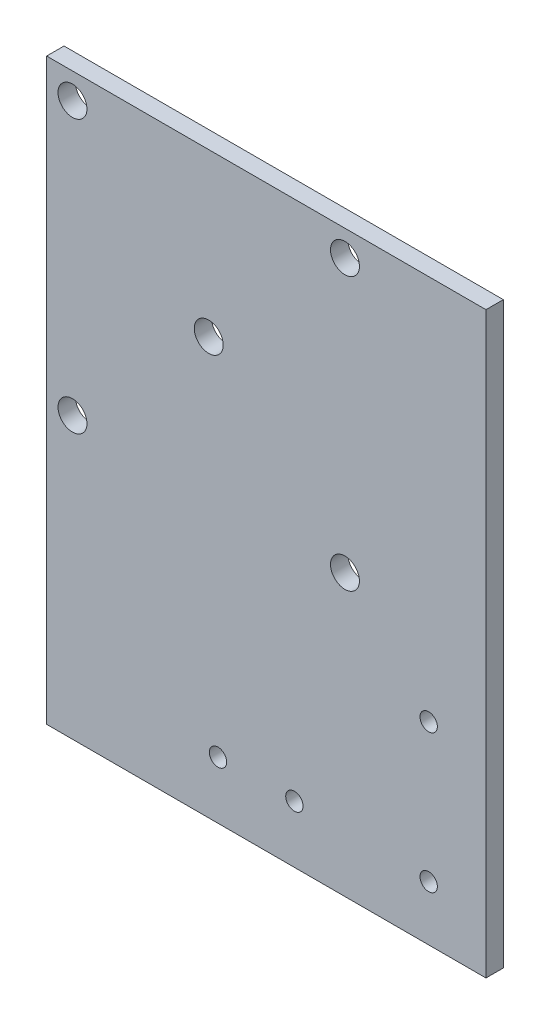
ISO-10303-21;
HEADER;
FILE_DESCRIPTION(('STEP AP214'),'2;1');
FILE_NAME('part.step','',(''),(''),'','','');
FILE_SCHEMA(('AUTOMOTIVE_DESIGN { 1 0 10303 214 1 1 1 1 }'));
ENDSEC;
DATA;
#1=APPLICATION_CONTEXT('core data for automotive mechanical design processes');
#2=APPLICATION_PROTOCOL_DEFINITION('international standard','automotive_design',2000,#1);
#3=PRODUCT_CONTEXT('',#1,'mechanical');
#4=PRODUCT('Part','Part','',(#3));
#5=PRODUCT_RELATED_PRODUCT_CATEGORY('part','',(#4));
#6=PRODUCT_DEFINITION_FORMATION('','',#4);
#7=PRODUCT_DEFINITION_CONTEXT('part definition',#1,'design');
#8=PRODUCT_DEFINITION('design','',#6,#7);
#9=PRODUCT_DEFINITION_SHAPE('','',#8);
#10=(LENGTH_UNIT() NAMED_UNIT(*) SI_UNIT(.MILLI.,.METRE.));
#11=(NAMED_UNIT(*) PLANE_ANGLE_UNIT() SI_UNIT($,.RADIAN.));
#12=(NAMED_UNIT(*) SI_UNIT($,.STERADIAN.) SOLID_ANGLE_UNIT());
#13=UNCERTAINTY_MEASURE_WITH_UNIT(LENGTH_MEASURE(1.E-05),#10,'distance_accuracy_value','');
#14=(GEOMETRIC_REPRESENTATION_CONTEXT(3) GLOBAL_UNCERTAINTY_ASSIGNED_CONTEXT((#13)) GLOBAL_UNIT_ASSIGNED_CONTEXT((#10,
#11,#12)) REPRESENTATION_CONTEXT('',''));
#15=CARTESIAN_POINT('',(0.,0.,0.));
#16=DIRECTION('',(0.,0.,1.));
#17=DIRECTION('',(1.,0.,0.));
#18=AXIS2_PLACEMENT_3D('',#15,#16,#17);
#19=CARTESIAN_POINT('',(0.,0.,3.));
#20=DIRECTION('',(1.,0.,0.));
#21=DIRECTION('',(0.,0.,-1.));
#22=AXIS2_PLACEMENT_3D('',#19,#20,#21);
#23=PLANE('',#22);
#24=DIRECTION('',(0.,-1.,0.));
#25=VECTOR('',#24,1.);
#26=CARTESIAN_POINT('',(0.,0.,0.));
#27=LINE('',#26,#25);
#28=CARTESIAN_POINT('',(0.,100.,0.));
#29=VERTEX_POINT('',#28);
#30=CARTESIAN_POINT('',(0.,0.,0.));
#31=VERTEX_POINT('',#30);
#32=EDGE_CURVE('E100',#29,#31,#27,.T.);
#33=ORIENTED_EDGE('',*,*,#32,.T.);
#34=DIRECTION('',(0.,0.,-1.));
#35=VECTOR('',#34,1.);
#36=CARTESIAN_POINT('',(0.,0.,3.));
#37=LINE('',#36,#35);
#38=CARTESIAN_POINT('',(0.,0.,3.));
#39=VERTEX_POINT('',#38);
#40=EDGE_CURVE('E11',#39,#31,#37,.T.);
#41=ORIENTED_EDGE('',*,*,#40,.F.);
#42=DIRECTION('',(0.,-1.,0.));
#43=VECTOR('',#42,1.);
#44=CARTESIAN_POINT('',(0.,0.,3.));
#45=LINE('',#44,#43);
#46=CARTESIAN_POINT('',(0.,100.,3.));
#47=VERTEX_POINT('',#46);
#48=EDGE_CURVE('E87',#47,#39,#45,.T.);
#49=ORIENTED_EDGE('',*,*,#48,.F.);
#50=DIRECTION('',(0.,0.,-1.));
#51=VECTOR('',#50,1.);
#52=CARTESIAN_POINT('',(0.,100.,3.));
#53=LINE('',#52,#51);
#54=EDGE_CURVE('E96',#47,#29,#53,.T.);
#55=ORIENTED_EDGE('',*,*,#54,.T.);
#56=EDGE_LOOP('',(#33,#41,#49,#55));
#57=FACE_BOUND('',#56,.T.);
#58=ADVANCED_FACE('F34',(#57),#23,.F.);
#59=CARTESIAN_POINT('',(0.,0.,3.));
#60=DIRECTION('',(0.,1.,0.));
#61=DIRECTION('',(0.,0.,1.));
#62=AXIS2_PLACEMENT_3D('',#59,#60,#61);
#63=PLANE('',#62);
#64=DIRECTION('',(1.,0.,0.));
#65=VECTOR('',#64,1.);
#66=CARTESIAN_POINT('',(0.,0.,0.));
#67=LINE('',#66,#65);
#68=CARTESIAN_POINT('',(75.9,0.,0.));
#69=VERTEX_POINT('',#68);
#70=EDGE_CURVE('E91',#31,#69,#67,.T.);
#71=ORIENTED_EDGE('',*,*,#70,.T.);
#72=DIRECTION('',(0.,0.,-1.));
#73=VECTOR('',#72,1.);
#74=CARTESIAN_POINT('',(75.9,0.,3.));
#75=LINE('',#74,#73);
#76=CARTESIAN_POINT('',(75.9,0.,3.));
#77=VERTEX_POINT('',#76);
#78=EDGE_CURVE('E43',#77,#69,#75,.T.);
#79=ORIENTED_EDGE('',*,*,#78,.F.);
#80=DIRECTION('',(1.,0.,0.));
#81=VECTOR('',#80,1.);
#82=CARTESIAN_POINT('',(0.,0.,3.));
#83=LINE('',#82,#81);
#84=EDGE_CURVE('E82',#39,#77,#83,.T.);
#85=ORIENTED_EDGE('',*,*,#84,.F.);
#86=ORIENTED_EDGE('',*,*,#40,.T.);
#87=EDGE_LOOP('',(#71,#79,#85,#86));
#88=FACE_BOUND('',#87,.T.);
#89=ADVANCED_FACE('F90',(#88),#63,.F.);
#90=CARTESIAN_POINT('',(75.9,0.,3.));
#91=DIRECTION('',(-1.,0.,0.));
#92=DIRECTION('',(0.,0.,1.));
#93=AXIS2_PLACEMENT_3D('',#90,#91,#92);
#94=PLANE('',#93);
#95=DIRECTION('',(0.,1.,0.));
#96=VECTOR('',#95,1.);
#97=CARTESIAN_POINT('',(75.9,0.,0.));
#98=LINE('',#97,#96);
#99=CARTESIAN_POINT('',(75.9,100.,0.));
#100=VERTEX_POINT('',#99);
#101=EDGE_CURVE('E69',#69,#100,#98,.T.);
#102=ORIENTED_EDGE('',*,*,#101,.T.);
#103=DIRECTION('',(0.,0.,-1.));
#104=VECTOR('',#103,1.);
#105=CARTESIAN_POINT('',(75.9,100.,3.));
#106=LINE('',#105,#104);
#107=CARTESIAN_POINT('',(75.9,100.,3.));
#108=VERTEX_POINT('',#107);
#109=EDGE_CURVE('E92',#108,#100,#106,.T.);
#110=ORIENTED_EDGE('',*,*,#109,.F.);
#111=DIRECTION('',(0.,1.,0.));
#112=VECTOR('',#111,1.);
#113=CARTESIAN_POINT('',(75.9,0.,3.));
#114=LINE('',#113,#112);
#115=EDGE_CURVE('E85',#77,#108,#114,.T.);
#116=ORIENTED_EDGE('',*,*,#115,.F.);
#117=ORIENTED_EDGE('',*,*,#78,.T.);
#118=EDGE_LOOP('',(#102,#110,#116,#117));
#119=FACE_BOUND('',#118,.T.);
#120=ADVANCED_FACE('F94',(#119),#94,.F.);
#121=CARTESIAN_POINT('',(0.,100.,3.));
#122=DIRECTION('',(0.,-1.,0.));
#123=DIRECTION('',(0.,0.,-1.));
#124=AXIS2_PLACEMENT_3D('',#121,#122,#123);
#125=PLANE('',#124);
#126=DIRECTION('',(-1.,0.,0.));
#127=VECTOR('',#126,1.);
#128=CARTESIAN_POINT('',(0.,100.,0.));
#129=LINE('',#128,#127);
#130=EDGE_CURVE('E75',#100,#29,#129,.T.);
#131=ORIENTED_EDGE('',*,*,#130,.T.);
#132=ORIENTED_EDGE('',*,*,#54,.F.);
#133=DIRECTION('',(-1.,0.,0.));
#134=VECTOR('',#133,1.);
#135=CARTESIAN_POINT('',(0.,100.,3.));
#136=LINE('',#135,#134);
#137=EDGE_CURVE('E52',#108,#47,#136,.T.);
#138=ORIENTED_EDGE('',*,*,#137,.F.);
#139=ORIENTED_EDGE('',*,*,#109,.T.);
#140=EDGE_LOOP('',(#131,#132,#138,#139));
#141=FACE_BOUND('',#140,.T.);
#142=ADVANCED_FACE('F170',(#141),#125,.F.);
#143=CARTESIAN_POINT('',(0.,0.,3.));
#144=DIRECTION('',(0.,0.,-1.));
#145=DIRECTION('',(-1.,0.,0.));
#146=AXIS2_PLACEMENT_3D('',#143,#144,#145);
#147=PLANE('',#146);
#148=CARTESIAN_POINT('',(27.9999999999996,72.,3.));
#149=DIRECTION('',(0.,0.,-1.));
#150=DIRECTION('',(-1.,0.,0.));
#151=AXIS2_PLACEMENT_3D('',#148,#149,#150);
#152=CIRCLE('',#151,2.5);
#153=CARTESIAN_POINT('',(25.4999999999996,72.,3.));
#154=VERTEX_POINT('',#153);
#155=EDGE_CURVE('E293',#154,#154,#152,.T.);
#156=ORIENTED_EDGE('',*,*,#155,.T.);
#157=EDGE_LOOP('',(#156));
#158=FACE_BOUND('',#157,.T.);
#159=CARTESIAN_POINT('',(42.8000000000001,9.90000000000004,3.));
#160=DIRECTION('',(0.,0.,-1.));
#161=DIRECTION('',(-1.,0.,0.));
#162=AXIS2_PLACEMENT_3D('',#159,#160,#161);
#163=CIRCLE('',#162,1.5);
#164=CARTESIAN_POINT('',(41.3000000000001,9.90000000000004,3.));
#165=VERTEX_POINT('',#164);
#166=EDGE_CURVE('E297',#165,#165,#163,.T.);
#167=ORIENTED_EDGE('',*,*,#166,.T.);
#168=EDGE_LOOP('',(#167));
#169=FACE_BOUND('',#168,.T.);
#170=CARTESIAN_POINT('',(29.6000000000001,9.90000000000004,3.));
#171=DIRECTION('',(0.,0.,-1.));
#172=DIRECTION('',(-1.,0.,0.));
#173=AXIS2_PLACEMENT_3D('',#170,#171,#172);
#174=CIRCLE('',#173,1.5);
#175=CARTESIAN_POINT('',(28.1000000000001,9.90000000000004,3.));
#176=VERTEX_POINT('',#175);
#177=EDGE_CURVE('E305',#176,#176,#174,.T.);
#178=ORIENTED_EDGE('',*,*,#177,.T.);
#179=EDGE_LOOP('',(#178));
#180=FACE_BOUND('',#179,.T.);
#181=CARTESIAN_POINT('',(66.0000000000001,9.47099371364919,3.));
#182=DIRECTION('',(0.,0.,1.));
#183=DIRECTION('',(1.,0.,0.));
#184=AXIS2_PLACEMENT_3D('',#181,#182,#183);
#185=CIRCLE('',#184,1.5);
#186=CARTESIAN_POINT('',(67.5000000000001,9.47099371364919,3.));
#187=VERTEX_POINT('',#186);
#188=EDGE_CURVE('E122',#187,#187,#185,.T.);
#189=ORIENTED_EDGE('',*,*,#188,.F.);
#190=EDGE_LOOP('',(#189));
#191=FACE_BOUND('',#190,.T.);
#192=CARTESIAN_POINT('',(66.0000000000001,33.3913700508154,3.));
#193=DIRECTION('',(0.,0.,1.));
#194=DIRECTION('',(1.,0.,0.));
#195=AXIS2_PLACEMENT_3D('',#192,#193,#194);
#196=CIRCLE('',#195,1.5);
#197=CARTESIAN_POINT('',(67.5000000000001,33.3913700508154,3.));
#198=VERTEX_POINT('',#197);
#199=EDGE_CURVE('E111',#198,#198,#196,.T.);
#200=ORIENTED_EDGE('',*,*,#199,.F.);
#201=EDGE_LOOP('',(#200));
#202=FACE_BOUND('',#201,.T.);
#203=CARTESIAN_POINT('',(51.5385822331381,48.4614177668615,3.));
#204=DIRECTION('',(0.,0.,-1.));
#205=DIRECTION('',(-1.,0.,0.));
#206=AXIS2_PLACEMENT_3D('',#203,#204,#205);
#207=CIRCLE('',#206,2.50000000000097);
#208=CARTESIAN_POINT('',(49.0385822331371,48.4614177668615,3.));
#209=VERTEX_POINT('',#208);
#210=EDGE_CURVE('E115',#209,#209,#207,.T.);
#211=ORIENTED_EDGE('',*,*,#210,.T.);
#212=EDGE_LOOP('',(#211));
#213=FACE_BOUND('',#212,.T.);
#214=CARTESIAN_POINT('',(4.46141776686215,48.4614177668615,3.));
#215=DIRECTION('',(0.,0.,-1.));
#216=DIRECTION('',(-1.,0.,0.));
#217=AXIS2_PLACEMENT_3D('',#214,#215,#216);
#218=CIRCLE('',#217,2.50000000000097);
#219=CARTESIAN_POINT('',(1.96141776686118,48.4614177668615,3.));
#220=VERTEX_POINT('',#219);
#221=EDGE_CURVE('E131',#220,#220,#218,.T.);
#222=ORIENTED_EDGE('',*,*,#221,.T.);
#223=EDGE_LOOP('',(#222));
#224=FACE_BOUND('',#223,.T.);
#225=CARTESIAN_POINT('',(4.46141776686213,95.5385822331373,3.));
#226=DIRECTION('',(0.,0.,-1.));
#227=DIRECTION('',(-1.,0.,0.));
#228=AXIS2_PLACEMENT_3D('',#225,#226,#227);
#229=CIRCLE('',#228,2.50000000000097);
#230=CARTESIAN_POINT('',(1.96141776686117,95.5385822331373,3.));
#231=VERTEX_POINT('',#230);
#232=EDGE_CURVE('E137',#231,#231,#229,.T.);
#233=ORIENTED_EDGE('',*,*,#232,.T.);
#234=EDGE_LOOP('',(#233));
#235=FACE_BOUND('',#234,.T.);
#236=CARTESIAN_POINT('',(51.5385822331375,95.5385822331374,3.));
#237=DIRECTION('',(0.,0.,-1.));
#238=DIRECTION('',(-1.,0.,0.));
#239=AXIS2_PLACEMENT_3D('',#236,#237,#238);
#240=CIRCLE('',#239,2.50000000000097);
#241=CARTESIAN_POINT('',(49.0385822331365,95.5385822331374,3.));
#242=VERTEX_POINT('',#241);
#243=EDGE_CURVE('E103',#242,#242,#240,.T.);
#244=ORIENTED_EDGE('',*,*,#243,.T.);
#245=EDGE_LOOP('',(#244));
#246=FACE_BOUND('',#245,.T.);
#247=ORIENTED_EDGE('',*,*,#48,.T.);
#248=ORIENTED_EDGE('',*,*,#84,.T.);
#249=ORIENTED_EDGE('',*,*,#115,.T.);
#250=ORIENTED_EDGE('',*,*,#137,.T.);
#251=EDGE_LOOP('',(#247,#248,#249,#250));
#252=FACE_BOUND('',#251,.T.);
#253=ADVANCED_FACE('F83',(#158,#169,#180,#191,#202,#213,#224,#235,#246,#252),#147,.F.);
#254=CARTESIAN_POINT('',(0.,0.,0.));
#255=DIRECTION('',(0.,0.,-1.));
#256=DIRECTION('',(-1.,0.,0.));
#257=AXIS2_PLACEMENT_3D('',#254,#255,#256);
#258=PLANE('',#257);
#259=CARTESIAN_POINT('',(27.9999999999996,72.,0.));
#260=DIRECTION('',(0.,0.,-1.));
#261=DIRECTION('',(-1.,0.,0.));
#262=AXIS2_PLACEMENT_3D('',#259,#260,#261);
#263=CIRCLE('',#262,2.5);
#264=CARTESIAN_POINT('',(25.4999999999996,72.,0.));
#265=VERTEX_POINT('',#264);
#266=EDGE_CURVE('E290',#265,#265,#263,.T.);
#267=ORIENTED_EDGE('',*,*,#266,.F.);
#268=EDGE_LOOP('',(#267));
#269=FACE_BOUND('',#268,.T.);
#270=CARTESIAN_POINT('',(42.8000000000001,9.90000000000004,0.));
#271=DIRECTION('',(0.,0.,-1.));
#272=DIRECTION('',(-1.,0.,0.));
#273=AXIS2_PLACEMENT_3D('',#270,#271,#272);
#274=CIRCLE('',#273,1.5);
#275=CARTESIAN_POINT('',(41.3000000000001,9.90000000000004,0.));
#276=VERTEX_POINT('',#275);
#277=EDGE_CURVE('E294',#276,#276,#274,.T.);
#278=ORIENTED_EDGE('',*,*,#277,.F.);
#279=EDGE_LOOP('',(#278));
#280=FACE_BOUND('',#279,.T.);
#281=CARTESIAN_POINT('',(29.6000000000001,9.90000000000004,0.));
#282=DIRECTION('',(0.,0.,-1.));
#283=DIRECTION('',(-1.,0.,0.));
#284=AXIS2_PLACEMENT_3D('',#281,#282,#283);
#285=CIRCLE('',#284,1.5);
#286=CARTESIAN_POINT('',(28.1000000000001,9.90000000000004,0.));
#287=VERTEX_POINT('',#286);
#288=EDGE_CURVE('E303',#287,#287,#285,.T.);
#289=ORIENTED_EDGE('',*,*,#288,.F.);
#290=EDGE_LOOP('',(#289));
#291=FACE_BOUND('',#290,.T.);
#292=CARTESIAN_POINT('',(66.0000000000001,9.47099371364919,0.));
#293=DIRECTION('',(0.,0.,-1.));
#294=DIRECTION('',(-1.,0.,0.));
#295=AXIS2_PLACEMENT_3D('',#292,#293,#294);
#296=CIRCLE('',#295,1.5);
#297=CARTESIAN_POINT('',(64.5000000000001,9.47099371364919,0.));
#298=VERTEX_POINT('',#297);
#299=EDGE_CURVE('E37',#298,#298,#296,.T.);
#300=ORIENTED_EDGE('',*,*,#299,.F.);
#301=EDGE_LOOP('',(#300));
#302=FACE_BOUND('',#301,.T.);
#303=CARTESIAN_POINT('',(66.0000000000001,33.3913700508154,0.));
#304=DIRECTION('',(0.,0.,-1.));
#305=DIRECTION('',(-1.,0.,0.));
#306=AXIS2_PLACEMENT_3D('',#303,#304,#305);
#307=CIRCLE('',#306,1.5);
#308=CARTESIAN_POINT('',(64.5000000000001,33.3913700508154,0.));
#309=VERTEX_POINT('',#308);
#310=EDGE_CURVE('E108',#309,#309,#307,.T.);
#311=ORIENTED_EDGE('',*,*,#310,.F.);
#312=EDGE_LOOP('',(#311));
#313=FACE_BOUND('',#312,.T.);
#314=CARTESIAN_POINT('',(51.5385822331381,48.4614177668615,0.));
#315=DIRECTION('',(0.,0.,-1.));
#316=DIRECTION('',(-1.,0.,0.));
#317=AXIS2_PLACEMENT_3D('',#314,#315,#316);
#318=CIRCLE('',#317,2.50000000000097);
#319=CARTESIAN_POINT('',(49.0385822331371,48.4614177668615,0.));
#320=VERTEX_POINT('',#319);
#321=EDGE_CURVE('E110',#320,#320,#318,.T.);
#322=ORIENTED_EDGE('',*,*,#321,.F.);
#323=EDGE_LOOP('',(#322));
#324=FACE_BOUND('',#323,.T.);
#325=CARTESIAN_POINT('',(4.46141776686215,48.4614177668615,0.));
#326=DIRECTION('',(0.,0.,-1.));
#327=DIRECTION('',(-1.,0.,0.));
#328=AXIS2_PLACEMENT_3D('',#325,#326,#327);
#329=CIRCLE('',#328,2.50000000000097);
#330=CARTESIAN_POINT('',(1.96141776686118,48.4614177668615,0.));
#331=VERTEX_POINT('',#330);
#332=EDGE_CURVE('E128',#331,#331,#329,.T.);
#333=ORIENTED_EDGE('',*,*,#332,.F.);
#334=EDGE_LOOP('',(#333));
#335=FACE_BOUND('',#334,.T.);
#336=CARTESIAN_POINT('',(4.46141776686213,95.5385822331373,0.));
#337=DIRECTION('',(0.,0.,-1.));
#338=DIRECTION('',(-1.,0.,0.));
#339=AXIS2_PLACEMENT_3D('',#336,#337,#338);
#340=CIRCLE('',#339,2.50000000000097);
#341=CARTESIAN_POINT('',(1.96141776686117,95.5385822331373,0.));
#342=VERTEX_POINT('',#341);
#343=EDGE_CURVE('E134',#342,#342,#340,.T.);
#344=ORIENTED_EDGE('',*,*,#343,.F.);
#345=EDGE_LOOP('',(#344));
#346=FACE_BOUND('',#345,.T.);
#347=CARTESIAN_POINT('',(51.5385822331375,95.5385822331374,0.));
#348=DIRECTION('',(0.,0.,-1.));
#349=DIRECTION('',(-1.,0.,0.));
#350=AXIS2_PLACEMENT_3D('',#347,#348,#349);
#351=CIRCLE('',#350,2.50000000000097);
#352=CARTESIAN_POINT('',(49.0385822331365,95.5385822331374,0.));
#353=VERTEX_POINT('',#352);
#354=EDGE_CURVE('E140',#353,#353,#351,.T.);
#355=ORIENTED_EDGE('',*,*,#354,.F.);
#356=EDGE_LOOP('',(#355));
#357=FACE_BOUND('',#356,.T.);
#358=ORIENTED_EDGE('',*,*,#32,.F.);
#359=ORIENTED_EDGE('',*,*,#130,.F.);
#360=ORIENTED_EDGE('',*,*,#101,.F.);
#361=ORIENTED_EDGE('',*,*,#70,.F.);
#362=EDGE_LOOP('',(#358,#359,#360,#361));
#363=FACE_BOUND('',#362,.T.);
#364=ADVANCED_FACE('F150',(#269,#280,#291,#302,#313,#324,#335,#346,#357,#363),#258,.T.);
#365=CARTESIAN_POINT('',(51.5385822331375,95.5385822331374,10.));
#366=DIRECTION('',(0.,0.,-1.));
#367=DIRECTION('',(-1.,0.,0.));
#368=AXIS2_PLACEMENT_3D('',#365,#366,#367);
#369=CYLINDRICAL_SURFACE('',#368,2.50000000000097);
#370=ORIENTED_EDGE('',*,*,#354,.T.);
#371=EDGE_LOOP('',(#370));
#372=FACE_BOUND('',#371,.T.);
#373=ORIENTED_EDGE('',*,*,#243,.F.);
#374=EDGE_LOOP('',(#373));
#375=FACE_BOUND('',#374,.T.);
#376=ADVANCED_FACE('F147',(#372,#375),#369,.F.);
#377=CARTESIAN_POINT('',(4.46141776686213,95.5385822331373,10.));
#378=DIRECTION('',(0.,0.,-1.));
#379=DIRECTION('',(-1.,0.,0.));
#380=AXIS2_PLACEMENT_3D('',#377,#378,#379);
#381=CYLINDRICAL_SURFACE('',#380,2.50000000000097);
#382=ORIENTED_EDGE('',*,*,#343,.T.);
#383=EDGE_LOOP('',(#382));
#384=FACE_BOUND('',#383,.T.);
#385=ORIENTED_EDGE('',*,*,#232,.F.);
#386=EDGE_LOOP('',(#385));
#387=FACE_BOUND('',#386,.T.);
#388=ADVANCED_FACE('F149',(#384,#387),#381,.F.);
#389=CARTESIAN_POINT('',(4.46141776686215,48.4614177668615,10.));
#390=DIRECTION('',(0.,0.,-1.));
#391=DIRECTION('',(-1.,0.,0.));
#392=AXIS2_PLACEMENT_3D('',#389,#390,#391);
#393=CYLINDRICAL_SURFACE('',#392,2.50000000000097);
#394=ORIENTED_EDGE('',*,*,#332,.T.);
#395=EDGE_LOOP('',(#394));
#396=FACE_BOUND('',#395,.T.);
#397=ORIENTED_EDGE('',*,*,#221,.F.);
#398=EDGE_LOOP('',(#397));
#399=FACE_BOUND('',#398,.T.);
#400=ADVANCED_FACE('F157',(#396,#399),#393,.F.);
#401=CARTESIAN_POINT('',(51.5385822331381,48.4614177668615,10.));
#402=DIRECTION('',(0.,0.,-1.));
#403=DIRECTION('',(-1.,0.,0.));
#404=AXIS2_PLACEMENT_3D('',#401,#402,#403);
#405=CYLINDRICAL_SURFACE('',#404,2.50000000000097);
#406=ORIENTED_EDGE('',*,*,#321,.T.);
#407=EDGE_LOOP('',(#406));
#408=FACE_BOUND('',#407,.T.);
#409=ORIENTED_EDGE('',*,*,#210,.F.);
#410=EDGE_LOOP('',(#409));
#411=FACE_BOUND('',#410,.T.);
#412=ADVANCED_FACE('F226',(#408,#411),#405,.F.);
#413=CARTESIAN_POINT('',(66.0000000000001,33.3913700508154,-7.));
#414=DIRECTION('',(0.,0.,1.));
#415=DIRECTION('',(1.,0.,0.));
#416=AXIS2_PLACEMENT_3D('',#413,#414,#415);
#417=CYLINDRICAL_SURFACE('',#416,1.5);
#418=ORIENTED_EDGE('',*,*,#310,.T.);
#419=EDGE_LOOP('',(#418));
#420=FACE_BOUND('',#419,.T.);
#421=ORIENTED_EDGE('',*,*,#199,.T.);
#422=EDGE_LOOP('',(#421));
#423=FACE_BOUND('',#422,.T.);
#424=ADVANCED_FACE('F235',(#420,#423),#417,.F.);
#425=CARTESIAN_POINT('',(66.0000000000001,9.47099371364919,-7.));
#426=DIRECTION('',(0.,0.,1.));
#427=DIRECTION('',(1.,0.,0.));
#428=AXIS2_PLACEMENT_3D('',#425,#426,#427);
#429=CYLINDRICAL_SURFACE('',#428,1.5);
#430=ORIENTED_EDGE('',*,*,#299,.T.);
#431=EDGE_LOOP('',(#430));
#432=FACE_BOUND('',#431,.T.);
#433=ORIENTED_EDGE('',*,*,#188,.T.);
#434=EDGE_LOOP('',(#433));
#435=FACE_BOUND('',#434,.T.);
#436=ADVANCED_FACE('F244',(#432,#435),#429,.F.);
#437=CARTESIAN_POINT('',(29.6000000000001,9.90000000000004,19.8));
#438=DIRECTION('',(0.,0.,-1.));
#439=DIRECTION('',(-1.,0.,0.));
#440=AXIS2_PLACEMENT_3D('',#437,#438,#439);
#441=CYLINDRICAL_SURFACE('',#440,1.5);
#442=CARTESIAN_POINT('',(28.1000000000001,9.90000000000004,0.));
#443=CARTESIAN_POINT('',(28.1000000000001,9.90000000000004,0.03125));
#444=CARTESIAN_POINT('',(28.1000000000001,9.90000000000004,0.0625000000000001));
#445=CARTESIAN_POINT('',(28.1000000000001,9.90000000000004,0.125));
#446=CARTESIAN_POINT('',(28.1000000000001,9.90000000000004,0.15625));
#447=CARTESIAN_POINT('',(28.1000000000001,9.90000000000004,0.21875));
#448=CARTESIAN_POINT('',(28.1000000000001,9.90000000000004,0.25));
#449=CARTESIAN_POINT('',(28.1000000000001,9.90000000000004,0.3125));
#450=CARTESIAN_POINT('',(28.1000000000001,9.90000000000004,0.34375));
#451=CARTESIAN_POINT('',(28.1000000000001,9.90000000000004,0.40625));
#452=CARTESIAN_POINT('',(28.1000000000001,9.90000000000004,0.4375));
#453=CARTESIAN_POINT('',(28.1000000000001,9.90000000000004,0.5));
#454=CARTESIAN_POINT('',(28.1000000000001,9.90000000000004,0.53125));
#455=CARTESIAN_POINT('',(28.1000000000001,9.90000000000004,0.593750000000001));
#456=CARTESIAN_POINT('',(28.1000000000001,9.90000000000004,0.625000000000001));
#457=CARTESIAN_POINT('',(28.1000000000001,9.90000000000004,0.687500000000001));
#458=CARTESIAN_POINT('',(28.1000000000001,9.90000000000004,0.718750000000001));
#459=CARTESIAN_POINT('',(28.1000000000001,9.90000000000004,0.781250000000001));
#460=CARTESIAN_POINT('',(28.1000000000001,9.90000000000004,0.812500000000001));
#461=CARTESIAN_POINT('',(28.1000000000001,9.90000000000004,0.875000000000001));
#462=CARTESIAN_POINT('',(28.1000000000001,9.90000000000004,0.906250000000001));
#463=CARTESIAN_POINT('',(28.1000000000001,9.90000000000004,0.968750000000001));
#464=CARTESIAN_POINT('',(28.1000000000001,9.90000000000004,1.));
#465=CARTESIAN_POINT('',(28.1000000000001,9.90000000000004,1.0625));
#466=CARTESIAN_POINT('',(28.1000000000001,9.90000000000004,1.09375));
#467=CARTESIAN_POINT('',(28.1000000000001,9.90000000000004,1.15625));
#468=CARTESIAN_POINT('',(28.1000000000001,9.90000000000004,1.1875));
#469=CARTESIAN_POINT('',(28.1000000000001,9.90000000000004,1.25));
#470=CARTESIAN_POINT('',(28.1000000000001,9.90000000000004,1.28125));
#471=CARTESIAN_POINT('',(28.1000000000001,9.90000000000004,1.34375));
#472=CARTESIAN_POINT('',(28.1000000000001,9.90000000000004,1.375));
#473=CARTESIAN_POINT('',(28.1000000000001,9.90000000000004,1.4375));
#474=CARTESIAN_POINT('',(28.1000000000001,9.90000000000004,1.46875));
#475=CARTESIAN_POINT('',(28.1000000000001,9.90000000000004,1.53125));
#476=CARTESIAN_POINT('',(28.1000000000001,9.90000000000004,1.5625));
#477=CARTESIAN_POINT('',(28.1000000000001,9.90000000000004,1.625));
#478=CARTESIAN_POINT('',(28.1000000000001,9.90000000000004,1.65625));
#479=CARTESIAN_POINT('',(28.1000000000001,9.90000000000004,1.71875));
#480=CARTESIAN_POINT('',(28.1000000000001,9.90000000000004,1.75));
#481=CARTESIAN_POINT('',(28.1000000000001,9.90000000000004,1.8125));
#482=CARTESIAN_POINT('',(28.1000000000001,9.90000000000004,1.84375));
#483=CARTESIAN_POINT('',(28.1000000000001,9.90000000000004,1.90625));
#484=CARTESIAN_POINT('',(28.1000000000001,9.90000000000004,1.9375));
#485=CARTESIAN_POINT('',(28.1000000000001,9.90000000000004,2.));
#486=CARTESIAN_POINT('',(28.1000000000001,9.90000000000004,2.03125));
#487=CARTESIAN_POINT('',(28.1000000000001,9.90000000000004,2.09375));
#488=CARTESIAN_POINT('',(28.1000000000001,9.90000000000004,2.125));
#489=CARTESIAN_POINT('',(28.1000000000001,9.90000000000004,2.1875));
#490=CARTESIAN_POINT('',(28.1000000000001,9.90000000000004,2.21875));
#491=CARTESIAN_POINT('',(28.1000000000001,9.90000000000004,2.28125));
#492=CARTESIAN_POINT('',(28.1000000000001,9.90000000000004,2.3125));
#493=CARTESIAN_POINT('',(28.1000000000001,9.90000000000004,2.375));
#494=CARTESIAN_POINT('',(28.1000000000001,9.90000000000004,2.40625));
#495=CARTESIAN_POINT('',(28.1000000000001,9.90000000000004,2.46875));
#496=CARTESIAN_POINT('',(28.1000000000001,9.90000000000004,2.5));
#497=CARTESIAN_POINT('',(28.1000000000001,9.90000000000004,2.5625));
#498=CARTESIAN_POINT('',(28.1000000000001,9.90000000000004,2.59375));
#499=CARTESIAN_POINT('',(28.1000000000001,9.90000000000004,2.65625));
#500=CARTESIAN_POINT('',(28.1000000000001,9.90000000000004,2.6875));
#501=CARTESIAN_POINT('',(28.1000000000001,9.90000000000004,2.75));
#502=CARTESIAN_POINT('',(28.1000000000001,9.90000000000004,2.78125));
#503=CARTESIAN_POINT('',(28.1000000000001,9.90000000000004,2.84375));
#504=CARTESIAN_POINT('',(28.1000000000001,9.90000000000004,2.875));
#505=CARTESIAN_POINT('',(28.1000000000001,9.90000000000004,2.9375));
#506=CARTESIAN_POINT('',(28.1000000000001,9.90000000000004,2.96875));
#507=CARTESIAN_POINT('',(28.1000000000001,9.90000000000004,3.));
#508=B_SPLINE_CURVE_WITH_KNOTS('',3,(#442,#443,#444,#445,#446,#447,#448,#449,#450,#451,#452,
#453,#454,#455,#456,#457,#458,#459,#460,#461,#462,#463,#464,#465,#466,#467,#468,#469,#470,#471,
#472,#473,#474,#475,#476,#477,#478,#479,#480,#481,#482,#483,#484,#485,#486,#487,#488,#489,#490,
#491,#492,#493,#494,#495,#496,#497,#498,#499,#500,#501,#502,#503,#504,#505,#506,#507),
.UNSPECIFIED.,.F.,.F.,(4,2,2,2,2,2,2,2,2,2,2,2,2,2,2,2,2,2,2,2,2,2,2,2,2,2,2,2,2,2,2,2,4),(0.,
0.0937500000000001,0.1875,0.28125,0.375,0.46875,0.5625,0.656250000000001,0.750000000000001,
0.843750000000001,0.937500000000001,1.03125,1.125,1.21875,1.3125,1.40625,1.5,1.59375,1.6875,
1.78125,1.875,1.96875,2.0625,2.15625,2.25,2.34375,2.4375,2.53125,2.625,2.71875,2.8125,2.90625,
3.),.UNSPECIFIED.);
#509=EDGE_CURVE('BSEAM252',#287,#176,#508,.T.);
#510=ORIENTED_EDGE('',*,*,#288,.T.);
#511=ORIENTED_EDGE('',*,*,#177,.F.);
#512=ORIENTED_EDGE('',*,*,#509,.T.);
#513=ORIENTED_EDGE('',*,*,#509,.F.);
#514=EDGE_LOOP('',(#510,#512,#511,#513));
#515=FACE_BOUND('',#514,.T.);
#516=ADVANCED_FACE('F252',(#515),#441,.F.);
#517=CARTESIAN_POINT('',(42.8000000000001,9.90000000000004,19.8));
#518=DIRECTION('',(0.,0.,-1.));
#519=DIRECTION('',(-1.,0.,0.));
#520=AXIS2_PLACEMENT_3D('',#517,#518,#519);
#521=CYLINDRICAL_SURFACE('',#520,1.5);
#522=CARTESIAN_POINT('',(41.3000000000001,9.90000000000004,0.));
#523=CARTESIAN_POINT('',(41.3000000000001,9.90000000000004,0.03125));
#524=CARTESIAN_POINT('',(41.3000000000001,9.90000000000004,0.0625000000000001));
#525=CARTESIAN_POINT('',(41.3000000000001,9.90000000000004,0.125));
#526=CARTESIAN_POINT('',(41.3000000000001,9.90000000000004,0.15625));
#527=CARTESIAN_POINT('',(41.3000000000001,9.90000000000004,0.21875));
#528=CARTESIAN_POINT('',(41.3000000000001,9.90000000000004,0.25));
#529=CARTESIAN_POINT('',(41.3000000000001,9.90000000000004,0.3125));
#530=CARTESIAN_POINT('',(41.3000000000001,9.90000000000004,0.34375));
#531=CARTESIAN_POINT('',(41.3000000000001,9.90000000000004,0.40625));
#532=CARTESIAN_POINT('',(41.3000000000001,9.90000000000004,0.4375));
#533=CARTESIAN_POINT('',(41.3000000000001,9.90000000000004,0.5));
#534=CARTESIAN_POINT('',(41.3000000000001,9.90000000000004,0.53125));
#535=CARTESIAN_POINT('',(41.3000000000001,9.90000000000004,0.593750000000001));
#536=CARTESIAN_POINT('',(41.3000000000001,9.90000000000004,0.625000000000001));
#537=CARTESIAN_POINT('',(41.3000000000001,9.90000000000004,0.687500000000001));
#538=CARTESIAN_POINT('',(41.3000000000001,9.90000000000004,0.718750000000001));
#539=CARTESIAN_POINT('',(41.3000000000001,9.90000000000004,0.781250000000001));
#540=CARTESIAN_POINT('',(41.3000000000001,9.90000000000004,0.812500000000001));
#541=CARTESIAN_POINT('',(41.3000000000001,9.90000000000004,0.875000000000001));
#542=CARTESIAN_POINT('',(41.3000000000001,9.90000000000004,0.906250000000001));
#543=CARTESIAN_POINT('',(41.3000000000001,9.90000000000004,0.968750000000001));
#544=CARTESIAN_POINT('',(41.3000000000001,9.90000000000004,1.));
#545=CARTESIAN_POINT('',(41.3000000000001,9.90000000000004,1.0625));
#546=CARTESIAN_POINT('',(41.3000000000001,9.90000000000004,1.09375));
#547=CARTESIAN_POINT('',(41.3000000000001,9.90000000000004,1.15625));
#548=CARTESIAN_POINT('',(41.3000000000001,9.90000000000004,1.1875));
#549=CARTESIAN_POINT('',(41.3000000000001,9.90000000000004,1.25));
#550=CARTESIAN_POINT('',(41.3000000000001,9.90000000000004,1.28125));
#551=CARTESIAN_POINT('',(41.3000000000001,9.90000000000004,1.34375));
#552=CARTESIAN_POINT('',(41.3000000000001,9.90000000000004,1.375));
#553=CARTESIAN_POINT('',(41.3000000000001,9.90000000000004,1.4375));
#554=CARTESIAN_POINT('',(41.3000000000001,9.90000000000004,1.46875));
#555=CARTESIAN_POINT('',(41.3000000000001,9.90000000000004,1.53125));
#556=CARTESIAN_POINT('',(41.3000000000001,9.90000000000004,1.5625));
#557=CARTESIAN_POINT('',(41.3000000000001,9.90000000000004,1.625));
#558=CARTESIAN_POINT('',(41.3000000000001,9.90000000000004,1.65625));
#559=CARTESIAN_POINT('',(41.3000000000001,9.90000000000004,1.71875));
#560=CARTESIAN_POINT('',(41.3000000000001,9.90000000000004,1.75));
#561=CARTESIAN_POINT('',(41.3000000000001,9.90000000000004,1.8125));
#562=CARTESIAN_POINT('',(41.3000000000001,9.90000000000004,1.84375));
#563=CARTESIAN_POINT('',(41.3000000000001,9.90000000000004,1.90625));
#564=CARTESIAN_POINT('',(41.3000000000001,9.90000000000004,1.9375));
#565=CARTESIAN_POINT('',(41.3000000000001,9.90000000000004,2.));
#566=CARTESIAN_POINT('',(41.3000000000001,9.90000000000004,2.03125));
#567=CARTESIAN_POINT('',(41.3000000000001,9.90000000000004,2.09375));
#568=CARTESIAN_POINT('',(41.3000000000001,9.90000000000004,2.125));
#569=CARTESIAN_POINT('',(41.3000000000001,9.90000000000004,2.1875));
#570=CARTESIAN_POINT('',(41.3000000000001,9.90000000000004,2.21875));
#571=CARTESIAN_POINT('',(41.3000000000001,9.90000000000004,2.28125));
#572=CARTESIAN_POINT('',(41.3000000000001,9.90000000000004,2.3125));
#573=CARTESIAN_POINT('',(41.3000000000001,9.90000000000004,2.375));
#574=CARTESIAN_POINT('',(41.3000000000001,9.90000000000004,2.40625));
#575=CARTESIAN_POINT('',(41.3000000000001,9.90000000000004,2.46875));
#576=CARTESIAN_POINT('',(41.3000000000001,9.90000000000004,2.5));
#577=CARTESIAN_POINT('',(41.3000000000001,9.90000000000004,2.5625));
#578=CARTESIAN_POINT('',(41.3000000000001,9.90000000000004,2.59375));
#579=CARTESIAN_POINT('',(41.3000000000001,9.90000000000004,2.65625));
#580=CARTESIAN_POINT('',(41.3000000000001,9.90000000000004,2.6875));
#581=CARTESIAN_POINT('',(41.3000000000001,9.90000000000004,2.75));
#582=CARTESIAN_POINT('',(41.3000000000001,9.90000000000004,2.78125));
#583=CARTESIAN_POINT('',(41.3000000000001,9.90000000000004,2.84375));
#584=CARTESIAN_POINT('',(41.3000000000001,9.90000000000004,2.875));
#585=CARTESIAN_POINT('',(41.3000000000001,9.90000000000004,2.9375));
#586=CARTESIAN_POINT('',(41.3000000000001,9.90000000000004,2.96875));
#587=CARTESIAN_POINT('',(41.3000000000001,9.90000000000004,3.));
#588=B_SPLINE_CURVE_WITH_KNOTS('',3,(#522,#523,#524,#525,#526,#527,#528,#529,#530,#531,#532,
#533,#534,#535,#536,#537,#538,#539,#540,#541,#542,#543,#544,#545,#546,#547,#548,#549,#550,#551,
#552,#553,#554,#555,#556,#557,#558,#559,#560,#561,#562,#563,#564,#565,#566,#567,#568,#569,#570,
#571,#572,#573,#574,#575,#576,#577,#578,#579,#580,#581,#582,#583,#584,#585,#586,#587),
.UNSPECIFIED.,.F.,.F.,(4,2,2,2,2,2,2,2,2,2,2,2,2,2,2,2,2,2,2,2,2,2,2,2,2,2,2,2,2,2,2,2,4),(0.,
0.0937500000000001,0.1875,0.28125,0.375,0.46875,0.5625,0.656250000000001,0.750000000000001,
0.843750000000001,0.937500000000001,1.03125,1.125,1.21875,1.3125,1.40625,1.5,1.59375,1.6875,
1.78125,1.875,1.96875,2.0625,2.15625,2.25,2.34375,2.4375,2.53125,2.625,2.71875,2.8125,2.90625,
3.),.UNSPECIFIED.);
#589=EDGE_CURVE('BSEAM261',#276,#165,#588,.T.);
#590=ORIENTED_EDGE('',*,*,#277,.T.);
#591=ORIENTED_EDGE('',*,*,#166,.F.);
#592=ORIENTED_EDGE('',*,*,#589,.T.);
#593=ORIENTED_EDGE('',*,*,#589,.F.);
#594=EDGE_LOOP('',(#590,#592,#591,#593));
#595=FACE_BOUND('',#594,.T.);
#596=ADVANCED_FACE('F261',(#595),#521,.F.);
#597=CARTESIAN_POINT('',(27.9999999999996,72.,10.));
#598=DIRECTION('',(0.,0.,-1.));
#599=DIRECTION('',(-1.,0.,0.));
#600=AXIS2_PLACEMENT_3D('',#597,#598,#599);
#601=CYLINDRICAL_SURFACE('',#600,2.5);
#602=ORIENTED_EDGE('',*,*,#266,.T.);
#603=EDGE_LOOP('',(#602));
#604=FACE_BOUND('',#603,.T.);
#605=ORIENTED_EDGE('',*,*,#155,.F.);
#606=EDGE_LOOP('',(#605));
#607=FACE_BOUND('',#606,.T.);
#608=ADVANCED_FACE('F269',(#604,#607),#601,.F.);
#609=CLOSED_SHELL('',(#58,#89,#120,#142,#253,#364,#376,#388,#400,#412,#424,#436,#516,#596,#608));
#610=MANIFOLD_SOLID_BREP('B2',#609);
#611=ADVANCED_BREP_SHAPE_REPRESENTATION('',(#18,#610),#14);
#612=SHAPE_DEFINITION_REPRESENTATION(#9,#611);
ENDSEC;
END-ISO-10303-21;
